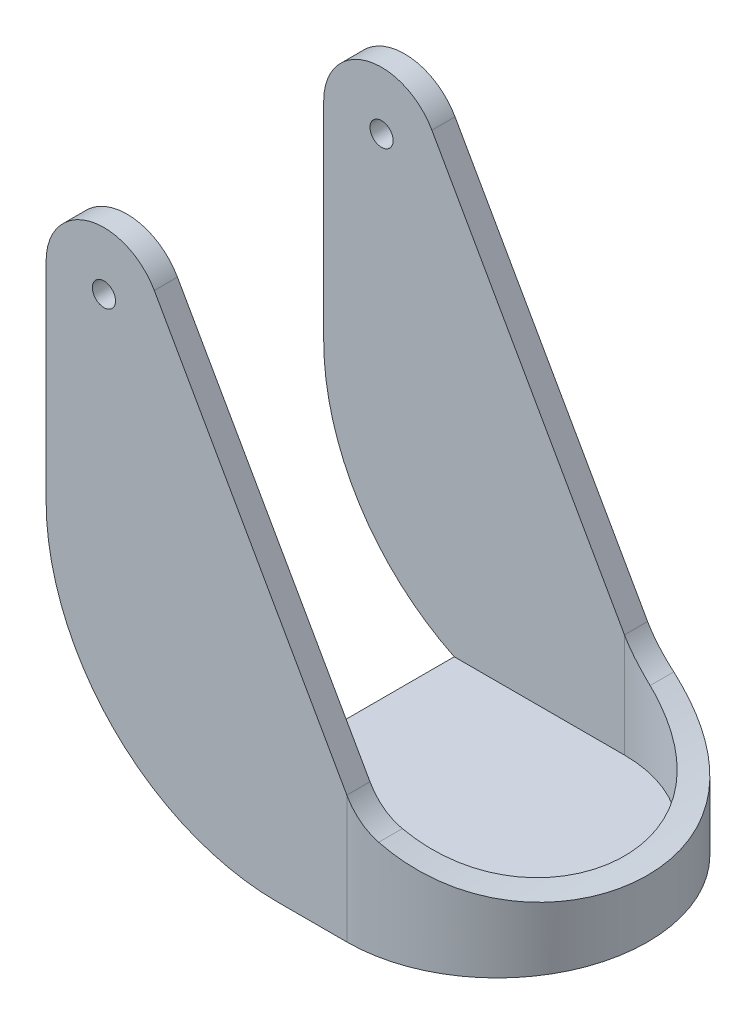
ISO-10303-21;
HEADER;
FILE_DESCRIPTION(('STEP AP214'),'2;1');
FILE_NAME('part.step','',(''),(''),'','','');
FILE_SCHEMA(('AUTOMOTIVE_DESIGN { 1 0 10303 214 1 1 1 1 }'));
ENDSEC;
DATA;
#1=APPLICATION_CONTEXT('core data for automotive mechanical design processes');
#2=APPLICATION_PROTOCOL_DEFINITION('international standard','automotive_design',2000,#1);
#3=PRODUCT_CONTEXT('',#1,'mechanical');
#4=PRODUCT('Part','Part','',(#3));
#5=PRODUCT_RELATED_PRODUCT_CATEGORY('part','',(#4));
#6=PRODUCT_DEFINITION_FORMATION('','',#4);
#7=PRODUCT_DEFINITION_CONTEXT('part definition',#1,'design');
#8=PRODUCT_DEFINITION('design','',#6,#7);
#9=PRODUCT_DEFINITION_SHAPE('','',#8);
#10=(LENGTH_UNIT() NAMED_UNIT(*) SI_UNIT(.MILLI.,.METRE.));
#11=(NAMED_UNIT(*) PLANE_ANGLE_UNIT() SI_UNIT($,.RADIAN.));
#12=(NAMED_UNIT(*) SI_UNIT($,.STERADIAN.) SOLID_ANGLE_UNIT());
#13=UNCERTAINTY_MEASURE_WITH_UNIT(LENGTH_MEASURE(1.E-05),#10,'distance_accuracy_value','');
#14=(GEOMETRIC_REPRESENTATION_CONTEXT(3) GLOBAL_UNCERTAINTY_ASSIGNED_CONTEXT((#13)) GLOBAL_UNIT_ASSIGNED_CONTEXT((#10,
#11,#12)) REPRESENTATION_CONTEXT('',''));
#15=CARTESIAN_POINT('',(0.,0.,0.));
#16=DIRECTION('',(0.,0.,1.));
#17=DIRECTION('',(1.,0.,0.));
#18=AXIS2_PLACEMENT_3D('',#15,#16,#17);
#19=CARTESIAN_POINT('',(-26.,13.,13.));
#20=DIRECTION('',(1.,0.,0.));
#21=DIRECTION('',(0.,0.,-1.));
#22=AXIS2_PLACEMENT_3D('',#19,#20,#21);
#23=PLANE('',#22);
#24=DIRECTION('',(0.,-1.,0.));
#25=VECTOR('',#24,1.);
#26=CARTESIAN_POINT('',(-26.,13.,-13.));
#27=LINE('',#26,#25);
#28=CARTESIAN_POINT('',(-26.,40.,-13.));
#29=VERTEX_POINT('',#28);
#30=CARTESIAN_POINT('',(-26.,22.,-13.));
#31=VERTEX_POINT('',#30);
#32=EDGE_CURVE('E165',#29,#31,#27,.T.);
#33=ORIENTED_EDGE('',*,*,#32,.T.);
#34=DIRECTION('',(0.,0.,1.));
#35=VECTOR('',#34,1.);
#36=CARTESIAN_POINT('',(-26.,22.,13.));
#37=LINE('',#36,#35);
#38=CARTESIAN_POINT('',(-26.,22.,-11.));
#39=VERTEX_POINT('',#38);
#40=EDGE_CURVE('E332',#31,#39,#37,.T.);
#41=ORIENTED_EDGE('',*,*,#40,.T.);
#42=DIRECTION('',(0.,-1.,0.));
#43=VECTOR('',#42,1.);
#44=CARTESIAN_POINT('',(-26.,13.,-11.));
#45=LINE('',#44,#43);
#46=CARTESIAN_POINT('',(-26.,40.,-11.));
#47=VERTEX_POINT('',#46);
#48=EDGE_CURVE('E265',#47,#39,#45,.T.);
#49=ORIENTED_EDGE('',*,*,#48,.F.);
#50=DIRECTION('',(0.,0.,-1.));
#51=VECTOR('',#50,1.);
#52=CARTESIAN_POINT('',(-26.,40.,-11.));
#53=LINE('',#52,#51);
#54=EDGE_CURVE('E273',#47,#29,#53,.T.);
#55=ORIENTED_EDGE('',*,*,#54,.T.);
#56=EDGE_LOOP('',(#33,#41,#49,#55));
#57=FACE_BOUND('',#56,.T.);
#58=ADVANCED_FACE('F41',(#57),#23,.F.);
#59=CARTESIAN_POINT('',(-26.,13.,-13.));
#60=DIRECTION('',(0.,0.,1.));
#61=DIRECTION('',(1.,0.,0.));
#62=AXIS2_PLACEMENT_3D('',#59,#60,#61);
#63=PLANE('',#62);
#64=DIRECTION('',(-1.,0.,0.));
#65=VECTOR('',#64,1.);
#66=CARTESIAN_POINT('',(0.,2.,-13.));
#67=LINE('',#66,#65);
#68=CARTESIAN_POINT('',(0.,2.,-13.));
#69=VERTEX_POINT('',#68);
#70=CARTESIAN_POINT('',(-6.,2.,-13.));
#71=VERTEX_POINT('',#70);
#72=EDGE_CURVE('E152',#69,#71,#67,.T.);
#73=ORIENTED_EDGE('',*,*,#72,.T.);
#74=CARTESIAN_POINT('',(-6.,22.,-13.));
#75=DIRECTION('',(0.,0.,1.));
#76=DIRECTION('',(1.,0.,0.));
#77=AXIS2_PLACEMENT_3D('',#74,#75,#76);
#78=CIRCLE('',#77,20.);
#79=EDGE_CURVE('E13',#71,#31,#78,.F.);
#80=ORIENTED_EDGE('',*,*,#79,.T.);
#81=ORIENTED_EDGE('',*,*,#32,.F.);
#82=CARTESIAN_POINT('',(-21.,40.,-13.));
#83=DIRECTION('',(0.,0.,1.));
#84=DIRECTION('',(-1.,0.,0.));
#85=AXIS2_PLACEMENT_3D('',#82,#83,#84);
#86=CIRCLE('',#85,5.);
#87=CARTESIAN_POINT('',(-16.6469149015077,42.4598069284569,-13.));
#88=VERTEX_POINT('',#87);
#89=EDGE_CURVE('E262',#88,#29,#86,.T.);
#90=ORIENTED_EDGE('',*,*,#89,.F.);
#91=DIRECTION('',(-0.491961385691387,0.87061701969845,0.));
#92=VECTOR('',#91,1.);
#93=CARTESIAN_POINT('',(-16.6469149015078,42.4598069284569,-13.));
#94=LINE('',#93,#92);
#95=CARTESIAN_POINT('',(0.,13.,-13.));
#96=VERTEX_POINT('',#95);
#97=EDGE_CURVE('E269',#96,#88,#94,.T.);
#98=ORIENTED_EDGE('',*,*,#97,.F.);
#99=DIRECTION('',(0.,-1.,0.));
#100=VECTOR('',#99,1.);
#101=CARTESIAN_POINT('',(0.,13.,-13.));
#102=LINE('',#101,#100);
#103=EDGE_CURVE('E163',#96,#69,#102,.T.);
#104=ORIENTED_EDGE('',*,*,#103,.T.);
#105=EDGE_LOOP('',(#73,#80,#81,#90,#98,#104));
#106=FACE_BOUND('',#105,.T.);
#107=CARTESIAN_POINT('',(-21.,40.,-13.));
#108=DIRECTION('',(0.,0.,1.));
#109=DIRECTION('',(1.,0.,0.));
#110=AXIS2_PLACEMENT_3D('',#107,#108,#109);
#111=CIRCLE('',#110,1.);
#112=CARTESIAN_POINT('',(-20.,40.,-13.));
#113=VERTEX_POINT('',#112);
#114=EDGE_CURVE('E254',#113,#113,#111,.T.);
#115=ORIENTED_EDGE('',*,*,#114,.T.);
#116=EDGE_LOOP('',(#115));
#117=FACE_BOUND('',#116,.T.);
#118=ADVANCED_FACE('F357',(#106,#117),#63,.F.);
#119=DIRECTION('',(0.,-1.,0.));
#120=VECTOR('',#119,1.);
#121=CARTESIAN_POINT('',(-26.,13.,11.));
#122=LINE('',#121,#120);
#123=CARTESIAN_POINT('',(-26.,40.,11.));
#124=VERTEX_POINT('',#123);
#125=CARTESIAN_POINT('',(-26.,22.,11.));
#126=VERTEX_POINT('',#125);
#127=EDGE_CURVE('E174',#124,#126,#122,.T.);
#128=ORIENTED_EDGE('',*,*,#127,.T.);
#129=DIRECTION('',(0.,0.,1.));
#130=VECTOR('',#129,1.);
#131=CARTESIAN_POINT('',(-26.,22.,13.));
#132=LINE('',#131,#130);
#133=CARTESIAN_POINT('',(-26.,22.,13.));
#134=VERTEX_POINT('',#133);
#135=EDGE_CURVE('E323',#126,#134,#132,.T.);
#136=ORIENTED_EDGE('',*,*,#135,.T.);
#137=DIRECTION('',(0.,-1.,0.));
#138=VECTOR('',#137,1.);
#139=CARTESIAN_POINT('',(-26.,13.,13.));
#140=LINE('',#139,#138);
#141=CARTESIAN_POINT('',(-26.,40.,13.));
#142=VERTEX_POINT('',#141);
#143=EDGE_CURVE('E162',#142,#134,#140,.T.);
#144=ORIENTED_EDGE('',*,*,#143,.F.);
#145=DIRECTION('',(0.,0.,1.));
#146=VECTOR('',#145,1.);
#147=CARTESIAN_POINT('',(-26.,40.,11.));
#148=LINE('',#147,#146);
#149=EDGE_CURVE('E167',#124,#142,#148,.T.);
#150=ORIENTED_EDGE('',*,*,#149,.F.);
#151=EDGE_LOOP('',(#128,#136,#144,#150));
#152=FACE_BOUND('',#151,.T.);
#153=ADVANCED_FACE('F359',(#152),#23,.F.);
#154=CARTESIAN_POINT('',(-26.,13.,13.));
#155=DIRECTION('',(0.,0.,-1.));
#156=DIRECTION('',(-1.,0.,0.));
#157=AXIS2_PLACEMENT_3D('',#154,#155,#156);
#158=PLANE('',#157);
#159=ORIENTED_EDGE('',*,*,#143,.T.);
#160=CARTESIAN_POINT('',(-6.,22.,13.));
#161=DIRECTION('',(0.,0.,-1.));
#162=DIRECTION('',(-1.,0.,0.));
#163=AXIS2_PLACEMENT_3D('',#160,#161,#162);
#164=CIRCLE('',#163,20.);
#165=CARTESIAN_POINT('',(-6.00000000000001,2.,13.));
#166=VERTEX_POINT('',#165);
#167=EDGE_CURVE('E63',#134,#166,#164,.F.);
#168=ORIENTED_EDGE('',*,*,#167,.T.);
#169=DIRECTION('',(1.,0.,0.));
#170=VECTOR('',#169,1.);
#171=CARTESIAN_POINT('',(-26.,2.,13.));
#172=LINE('',#171,#170);
#173=CARTESIAN_POINT('',(0.,2.,13.));
#174=VERTEX_POINT('',#173);
#175=EDGE_CURVE('E139',#166,#174,#172,.T.);
#176=ORIENTED_EDGE('',*,*,#175,.T.);
#177=DIRECTION('',(0.,-1.,0.));
#178=VECTOR('',#177,1.);
#179=CARTESIAN_POINT('',(0.,13.,13.));
#180=LINE('',#179,#178);
#181=CARTESIAN_POINT('',(0.,13.,13.));
#182=VERTEX_POINT('',#181);
#183=EDGE_CURVE('E145',#182,#174,#180,.T.);
#184=ORIENTED_EDGE('',*,*,#183,.F.);
#185=DIRECTION('',(-0.491961385691387,0.87061701969845,0.));
#186=VECTOR('',#185,1.);
#187=CARTESIAN_POINT('',(-16.6469149015078,42.4598069284569,13.));
#188=LINE('',#187,#186);
#189=CARTESIAN_POINT('',(-16.6469149015077,42.4598069284569,13.));
#190=VERTEX_POINT('',#189);
#191=EDGE_CURVE('E289',#182,#190,#188,.T.);
#192=ORIENTED_EDGE('',*,*,#191,.T.);
#193=CARTESIAN_POINT('',(-21.,40.,13.));
#194=DIRECTION('',(0.,0.,1.));
#195=DIRECTION('',(-1.,0.,0.));
#196=AXIS2_PLACEMENT_3D('',#193,#194,#195);
#197=CIRCLE('',#196,5.);
#198=EDGE_CURVE('E295',#190,#142,#197,.T.);
#199=ORIENTED_EDGE('',*,*,#198,.T.);
#200=EDGE_LOOP('',(#159,#168,#176,#184,#192,#199));
#201=FACE_BOUND('',#200,.T.);
#202=CARTESIAN_POINT('',(-21.,40.,13.));
#203=DIRECTION('',(0.,0.,1.));
#204=DIRECTION('',(1.,0.,0.));
#205=AXIS2_PLACEMENT_3D('',#202,#203,#204);
#206=CIRCLE('',#205,1.);
#207=CARTESIAN_POINT('',(-20.,40.,13.));
#208=VERTEX_POINT('',#207);
#209=EDGE_CURVE('E280',#208,#208,#206,.T.);
#210=ORIENTED_EDGE('',*,*,#209,.F.);
#211=EDGE_LOOP('',(#210));
#212=FACE_BOUND('',#211,.T.);
#213=ADVANCED_FACE('F141',(#201,#212),#158,.F.);
#214=CARTESIAN_POINT('',(0.,13.,0.));
#215=DIRECTION('',(0.,-1.,0.));
#216=DIRECTION('',(0.,0.,-1.));
#217=AXIS2_PLACEMENT_3D('',#214,#215,#216);
#218=CYLINDRICAL_SURFACE('',#217,13.);
#219=ORIENTED_EDGE('',*,*,#183,.T.);
#220=CARTESIAN_POINT('',(0.,2.,0.));
#221=DIRECTION('',(0.,1.,0.));
#222=DIRECTION('',(0.,0.,1.));
#223=AXIS2_PLACEMENT_3D('',#220,#221,#222);
#224=CIRCLE('',#223,13.);
#225=EDGE_CURVE('E146',#174,#69,#224,.T.);
#226=ORIENTED_EDGE('',*,*,#225,.T.);
#227=ORIENTED_EDGE('',*,*,#103,.F.);
#228=CARTESIAN_POINT('',(0.,13.,-13.));
#229=CARTESIAN_POINT('',(0.0811098745886927,12.8564208709931,-12.9999939418672));
#230=CARTESIAN_POINT('',(0.16817712729965,12.7161966098071,-12.9992411044523));
#231=CARTESIAN_POINT('',(0.353560432381058,12.4433693045474,-12.9955235608234));
#232=CARTESIAN_POINT('',(0.451879506114819,12.310768321921,-12.9925582593283));
#233=CARTESIAN_POINT('',(0.656443601674111,12.0574129699773,-12.983808451302));
#234=CARTESIAN_POINT('',(0.762426196293615,11.9364441700734,-12.978096930991));
#235=CARTESIAN_POINT('',(0.983622464164972,11.7035332281863,-12.9632082421014));
#236=CARTESIAN_POINT('',(1.09883378784987,11.5915888031334,-12.9540319534321));
#237=CARTESIAN_POINT('',(1.31493346265966,11.3978241402921,-12.9336919006638));
#238=CARTESIAN_POINT('',(1.41438569893112,11.3143208058399,-12.9232367143954));
#239=CARTESIAN_POINT('',(1.61826498252739,11.1540989858787,-12.8992927868903));
#240=CARTESIAN_POINT('',(1.72269175183268,11.0773801218785,-12.8858042150287));
#241=CARTESIAN_POINT('',(1.93818351497277,10.929539338955,-12.8551747219404));
#242=CARTESIAN_POINT('',(2.04934152185301,10.85856747827,-12.8379635093208));
#243=CARTESIAN_POINT('',(2.27562857780598,10.7243199328689,-12.7997944595318));
#244=CARTESIAN_POINT('',(2.39075858853556,10.6610461289434,-12.7788357098401));
#245=CARTESIAN_POINT('',(2.50753237754954,10.601775609478,-12.7558724270644));
#246=B_SPLINE_CURVE_WITH_KNOTS('',3,(#228,#229,#230,#231,#232,#233,#234,#235,#236,#237,#238,
#239,#240,#241,#242,#243,#244,#245),.UNSPECIFIED.,.F.,.F.,(4,2,2,2,2,2,2,2,4),(0.,
0.49459053828577,0.989314198095594,1.47156096154483,1.95368533635482,2.34423307721305,
2.73475901646833,3.13342788848221,3.53219396857059),.UNSPECIFIED.);
#247=CARTESIAN_POINT('',(2.50753237754954,10.601775609478,-12.7558724270644));
#248=VERTEX_POINT('',#247);
#249=EDGE_CURVE('E222',#96,#248,#246,.T.);
#250=ORIENTED_EDGE('',*,*,#249,.T.);
#251=CARTESIAN_POINT('',(2.50753237754953,10.601775609478,-12.7558724270644));
#252=CARTESIAN_POINT('',(2.67357989237057,10.5174722997083,-12.7232309247006));
#253=CARTESIAN_POINT('',(2.83967471423074,10.4346072048725,-12.6872121136112));
#254=CARTESIAN_POINT('',(3.17168859235779,10.2718170739135,-12.6083114270852));
#255=CARTESIAN_POINT('',(3.33760763591024,10.1918922380132,-12.5654290853223));
#256=CARTESIAN_POINT('',(3.83473437252045,9.95660602571069,-12.4263110338985));
#257=CARTESIAN_POINT('',(4.16523846132185,9.80577004941899,-12.3196185472035));
#258=CARTESIAN_POINT('',(4.82181993085827,9.5166055897683,-12.0777743817212));
#259=CARTESIAN_POINT('',(5.1478909820654,9.37829366072567,-11.9425857996477));
#260=CARTESIAN_POINT('',(5.79214557045279,9.11473593212956,-11.6437577120768));
#261=CARTESIAN_POINT('',(6.11033040592112,8.98948797084776,-11.4801229256339));
#262=CARTESIAN_POINT('',(6.73672002925522,8.75177380438963,-11.1241531390974));
#263=CARTESIAN_POINT('',(7.04488980465667,8.63934957769805,-10.9317283927471));
#264=CARTESIAN_POINT('',(7.64701851089102,8.42761201011177,-10.5193282256813));
#265=CARTESIAN_POINT('',(7.94097651727815,8.3282995213828,-10.299351016069));
#266=CARTESIAN_POINT('',(8.51118603942403,8.14255583070751,-9.83336731553107));
#267=CARTESIAN_POINT('',(8.78745943943964,8.05610852565698,-9.58739403461675));
#268=CARTESIAN_POINT('',(9.31975857278978,7.89539054260055,-9.0708120918948));
#269=CARTESIAN_POINT('',(9.57578547674543,7.82111916033477,-8.80020485633335));
#270=CARTESIAN_POINT('',(10.0522770557004,7.68757003340984,-8.25088102759384));
#271=CARTESIAN_POINT('',(10.273895058848,7.62771636575221,-7.97330340154314));
#272=CARTESIAN_POINT('',(10.6944464145798,7.51760888399712,-7.39968120959303));
#273=CARTESIAN_POINT('',(10.8933804377008,7.46735478610744,-7.10363718995922));
#274=CARTESIAN_POINT('',(11.266841061917,7.37568547519035,-6.49506065711169));
#275=CARTESIAN_POINT('',(11.4413571533449,7.33427406411417,-6.18252112331822));
#276=CARTESIAN_POINT('',(11.764341138228,7.25958083284556,-5.54332924245456));
#277=CARTESIAN_POINT('',(11.9128089675093,7.22629903268157,-5.21667686061773));
#278=CARTESIAN_POINT('',(12.1808397966009,7.16752436951811,-4.5555340842219));
#279=CARTESIAN_POINT('',(12.3007209946572,7.14194483941453,-4.22118031417595));
#280=CARTESIAN_POINT('',(12.5128154564488,7.09747331744763,-3.54338076740806));
#281=CARTESIAN_POINT('',(12.6050290244956,7.0785812520296,-3.19993509073168));
#282=CARTESIAN_POINT('',(12.7610413087791,7.04701579749399,-2.50641889838904));
#283=CARTESIAN_POINT('',(12.824843834045,7.03434157473564,-2.15634927735032));
#284=CARTESIAN_POINT('',(12.9235510907368,7.01487071539654,-1.4519964374477));
#285=CARTESIAN_POINT('',(12.9584556055172,7.00807412287978,-1.09771318701482));
#286=CARTESIAN_POINT('',(12.9992231512338,7.00014508023099,-0.385161934752053));
#287=CARTESIAN_POINT('',(13.0049007464633,6.99904879634174,-0.0268829086747976));
#288=CARTESIAN_POINT('',(12.9866698320836,7.00258639311315,0.688894132465764));
#289=CARTESIAN_POINT('',(12.962761211018,7.00722029536039,1.04639214458178));
#290=CARTESIAN_POINT('',(12.8855433305379,7.02235011602428,1.75809574579851));
#291=CARTESIAN_POINT('',(12.8322323365857,7.0328463802804,2.11230113940372));
#292=CARTESIAN_POINT('',(12.6966310918198,7.05998929410228,2.81488183404293));
#293=CARTESIAN_POINT('',(12.6143408586279,7.07663593992812,3.16325713862196));
#294=CARTESIAN_POINT('',(12.421288686113,7.11654313655217,3.8522438140729));
#295=CARTESIAN_POINT('',(12.3104814867209,7.13981420744697,4.19284189724551));
#296=CARTESIAN_POINT('',(12.0613712028866,7.19351680525583,4.86324978051866));
#297=CARTESIAN_POINT('',(11.9230680834531,7.22394834128231,5.19305956688941));
#298=CARTESIAN_POINT('',(11.6201431996891,7.29262289301151,5.83949238078567));
#299=CARTESIAN_POINT('',(11.4555231288622,7.33086540611948,6.15611625517706));
#300=CARTESIAN_POINT('',(11.1013869056699,7.41587743629413,6.77391892242735));
#301=CARTESIAN_POINT('',(10.9118709482686,7.46264688658597,7.07509783621276));
#302=CARTESIAN_POINT('',(10.5107370534454,7.56516655177487,7.65826125788489));
#303=CARTESIAN_POINT('',(10.2992459898781,7.62086612254129,7.94034194850334));
#304=CARTESIAN_POINT('',(9.8552272799391,7.74212833853623,8.48516282962268));
#305=CARTESIAN_POINT('',(9.62269967657087,7.80769096360263,8.74790305965782));
#306=CARTESIAN_POINT('',(9.13878265996559,7.94930733088135,9.25228528761113));
#307=CARTESIAN_POINT('',(8.88739521236258,8.02535998048022,9.49392947856262));
#308=CARTESIAN_POINT('',(8.36809478477809,8.1884873603282,9.95467111270657));
#309=CARTESIAN_POINT('',(8.10018213979217,8.27556186718201,10.1737690127129));
#310=CARTESIAN_POINT('',(7.55063244720755,8.46101801043554,10.588022887138));
#311=CARTESIAN_POINT('',(7.26901044257387,8.55938740742221,10.7832043124905));
#312=CARTESIAN_POINT('',(6.69435386448393,8.76772951910135,11.1490654567298));
#313=CARTESIAN_POINT('',(6.40131843650019,8.87770310366153,11.3197433365262));
#314=CARTESIAN_POINT('',(5.80654116816105,9.10925532505222,11.6360438177985));
#315=CARTESIAN_POINT('',(5.50480098561618,9.23083176218085,11.7816711538151));
#316=CARTESIAN_POINT('',(4.8952248905677,9.48541691669351,12.0477111667087));
#317=CARTESIAN_POINT('',(4.58739077578059,9.61842230009337,12.1681311619374));
#318=CARTESIAN_POINT('',(3.98434499133455,9.88826900253964,12.3782666779978));
#319=CARTESIAN_POINT('',(3.68932248469592,10.0245392946381,12.4692653571835));
#320=CARTESIAN_POINT('',(3.09862557714084,10.3062959982207,12.629016672693));
#321=CARTESIAN_POINT('',(2.80295473475085,10.4517581246053,12.6978252202721));
#322=CARTESIAN_POINT('',(2.50753237754953,10.601775609478,12.7558724270644));
#323=B_SPLINE_CURVE_WITH_KNOTS('',3,(#251,#252,#253,#254,#255,#256,#257,#258,#259,#260,#261,
#262,#263,#264,#265,#266,#267,#268,#269,#270,#271,#272,#273,#274,#275,#276,#277,#278,#279,#280,
#281,#282,#283,#284,#285,#286,#287,#288,#289,#290,#291,#292,#293,#294,#295,#296,#297,#298,#299,
#300,#301,#302,#303,#304,#305,#306,#307,#308,#309,#310,#311,#312,#313,#314,#315,#316,#317,#318,
#319,#320,#321,#322),.UNSPECIFIED.,.F.,.F.,(4,2,2,2,2,2,2,2,2,2,2,2,2,2,2,2,2,2,2,2,2,2,2,2,2,2,
2,2,2,2,2,2,2,2,2,4),(0.,0.567112976310076,1.13426450012161,2.26881674171251,3.40484738951128,
4.54068975617926,5.68014961751813,6.81968349887932,7.95777882928399,9.09580830858987,
10.1751149528512,11.254389684615,12.3341275249764,13.4138680253961,14.4809613160366,
15.548042869467,16.6149813176453,17.6819277644845,18.7556353837638,19.8293470478968,
20.9031220604064,21.976896419977,23.0523856211102,24.127876190918,25.203297580429,
26.278710548629,27.3482274177885,28.4177421006644,29.4871454696976,30.5565271671155,
31.6247608028388,32.6930745719586,33.7611862079207,34.8289873116738,35.8405464853042,
36.8495366054198),.UNSPECIFIED.);
#324=CARTESIAN_POINT('',(2.50753237754954,10.601775609478,12.7558724270644));
#325=VERTEX_POINT('',#324);
#326=EDGE_CURVE('E240',#248,#325,#323,.T.);
#327=ORIENTED_EDGE('',*,*,#326,.T.);
#328=CARTESIAN_POINT('',(2.50753237754954,10.601775609478,12.7558724270644));
#329=CARTESIAN_POINT('',(2.36275255318751,10.6752458422251,12.784350817623));
#330=CARTESIAN_POINT('',(2.22051363780897,10.7548835675639,12.8097343064124));
#331=CARTESIAN_POINT('',(1.94236483698037,10.9258972686388,12.8548413357145));
#332=CARTESIAN_POINT('',(1.80645390428157,11.017271292602,12.8745658155732));
#333=CARTESIAN_POINT('',(1.5454597928653,11.208764113998,12.9084651118122));
#334=CARTESIAN_POINT('',(1.42019096431867,11.3086075121459,12.9227662292402));
#335=CARTESIAN_POINT('',(1.17785005366185,11.5181732497238,12.947103945901));
#336=CARTESIAN_POINT('',(1.06077680152191,11.6278941738691,12.9571411549057));
#337=CARTESIAN_POINT('',(0.765604247706876,11.9277196823736,12.9787267686029));
#338=CARTESIAN_POINT('',(0.594819527697823,12.125387546177,12.9873346235273));
#339=CARTESIAN_POINT('',(0.357442538882254,12.439320966113,12.9953339978572));
#340=CARTESIAN_POINT('',(0.280758612036687,12.5480896788757,12.9971742423066));
#341=CARTESIAN_POINT('',(0.134773495035032,12.7704988419723,12.9995050276732));
#342=CARTESIAN_POINT('',(0.0654728060335353,12.8841396222759,12.9999954770259));
#343=CARTESIAN_POINT('',(0.,13.,13.));
#344=B_SPLINE_CURVE_WITH_KNOTS('',3,(#328,#329,#330,#331,#332,#333,#334,#335,#336,#337,#338,
#339,#340,#341,#342,#343),.UNSPECIFIED.,.F.,.F.,(4,2,2,2,2,2,2,4),(0.,0.494312878453947,
0.988543657744197,1.47043087615315,1.95224915772629,2.73363888097451,3.13267758361167,
3.53174335470355),.UNSPECIFIED.);
#345=EDGE_CURVE('E160',#325,#182,#344,.T.);
#346=ORIENTED_EDGE('',*,*,#345,.T.);
#347=EDGE_LOOP('',(#219,#226,#227,#250,#327,#346));
#348=FACE_BOUND('',#347,.T.);
#349=ADVANCED_FACE('F158',(#348),#218,.T.);
#350=CARTESIAN_POINT('',(-21.,40.,11.));
#351=DIRECTION('',(0.,0.,1.));
#352=DIRECTION('',(1.,0.,0.));
#353=AXIS2_PLACEMENT_3D('',#350,#351,#352);
#354=CYLINDRICAL_SURFACE('',#353,5.);
#355=ORIENTED_EDGE('',*,*,#198,.F.);
#356=DIRECTION('',(0.,0.,1.));
#357=VECTOR('',#356,1.);
#358=CARTESIAN_POINT('',(-16.6469149015077,42.4598069284569,11.));
#359=LINE('',#358,#357);
#360=CARTESIAN_POINT('',(-16.6469149015077,42.4598069284569,11.));
#361=VERTEX_POINT('',#360);
#362=EDGE_CURVE('E303',#361,#190,#359,.T.);
#363=ORIENTED_EDGE('',*,*,#362,.F.);
#364=CARTESIAN_POINT('',(-21.,40.,11.));
#365=DIRECTION('',(0.,0.,1.));
#366=DIRECTION('',(-1.,0.,0.));
#367=AXIS2_PLACEMENT_3D('',#364,#365,#366);
#368=CIRCLE('',#367,5.);
#369=EDGE_CURVE('E178',#361,#124,#368,.T.);
#370=ORIENTED_EDGE('',*,*,#369,.T.);
#371=ORIENTED_EDGE('',*,*,#149,.T.);
#372=EDGE_LOOP('',(#355,#363,#370,#371));
#373=FACE_BOUND('',#372,.T.);
#374=ADVANCED_FACE('F234',(#373),#354,.T.);
#375=CARTESIAN_POINT('',(-16.6469149015078,42.4598069284569,11.));
#376=DIRECTION('',(0.87061701969845,0.491961385691387,0.));
#377=DIRECTION('',(-0.491961385691387,0.87061701969845,0.));
#378=AXIS2_PLACEMENT_3D('',#375,#376,#377);
#379=PLANE('',#378);
#380=ORIENTED_EDGE('',*,*,#191,.F.);
#381=DIRECTION('',(0.,0.,1.));
#382=VECTOR('',#381,1.);
#383=CARTESIAN_POINT('',(0.,13.,11.));
#384=LINE('',#383,#382);
#385=CARTESIAN_POINT('',(0.,13.,11.));
#386=VERTEX_POINT('',#385);
#387=EDGE_CURVE('E177',#386,#182,#384,.T.);
#388=ORIENTED_EDGE('',*,*,#387,.F.);
#389=DIRECTION('',(-0.491961385691387,0.87061701969845,0.));
#390=VECTOR('',#389,1.);
#391=CARTESIAN_POINT('',(-16.6469149015078,42.4598069284569,11.));
#392=LINE('',#391,#390);
#393=EDGE_CURVE('E292',#386,#361,#392,.T.);
#394=ORIENTED_EDGE('',*,*,#393,.T.);
#395=ORIENTED_EDGE('',*,*,#362,.T.);
#396=EDGE_LOOP('',(#380,#388,#394,#395));
#397=FACE_BOUND('',#396,.T.);
#398=ADVANCED_FACE('F235',(#397),#379,.T.);
#399=CARTESIAN_POINT('',(-21.,40.,11.));
#400=DIRECTION('',(0.,0.,-1.));
#401=DIRECTION('',(-1.,0.,0.));
#402=AXIS2_PLACEMENT_3D('',#399,#400,#401);
#403=PLANE('',#402);
#404=CARTESIAN_POINT('',(-21.,40.,11.));
#405=DIRECTION('',(0.,0.,1.));
#406=DIRECTION('',(1.,0.,0.));
#407=AXIS2_PLACEMENT_3D('',#404,#405,#406);
#408=CIRCLE('',#407,1.);
#409=CARTESIAN_POINT('',(-20.,40.,11.));
#410=VERTEX_POINT('',#409);
#411=EDGE_CURVE('E286',#410,#410,#408,.T.);
#412=ORIENTED_EDGE('',*,*,#411,.T.);
#413=EDGE_LOOP('',(#412));
#414=FACE_BOUND('',#413,.T.);
#415=DIRECTION('',(-1.,0.,0.));
#416=VECTOR('',#415,1.);
#417=CARTESIAN_POINT('',(-26.,4.,11.));
#418=LINE('',#417,#416);
#419=CARTESIAN_POINT('',(0.,4.,11.));
#420=VERTEX_POINT('',#419);
#421=CARTESIAN_POINT('',(-14.7177978870814,4.,11.));
#422=VERTEX_POINT('',#421);
#423=EDGE_CURVE('E246',#420,#422,#418,.T.);
#424=ORIENTED_EDGE('',*,*,#423,.T.);
#425=CARTESIAN_POINT('',(-6.,22.,11.));
#426=DIRECTION('',(0.,0.,-1.));
#427=DIRECTION('',(-1.,0.,0.));
#428=AXIS2_PLACEMENT_3D('',#425,#426,#427);
#429=CIRCLE('',#428,20.);
#430=EDGE_CURVE('E324',#422,#126,#429,.T.);
#431=ORIENTED_EDGE('',*,*,#430,.T.);
#432=ORIENTED_EDGE('',*,*,#127,.F.);
#433=ORIENTED_EDGE('',*,*,#369,.F.);
#434=ORIENTED_EDGE('',*,*,#393,.F.);
#435=DIRECTION('',(0.,1.,0.));
#436=VECTOR('',#435,1.);
#437=CARTESIAN_POINT('',(0.,-42.0464865000618,11.));
#438=LINE('',#437,#436);
#439=EDGE_CURVE('E245',#420,#386,#438,.T.);
#440=ORIENTED_EDGE('',*,*,#439,.F.);
#441=EDGE_LOOP('',(#424,#431,#432,#433,#434,#440));
#442=FACE_BOUND('',#441,.T.);
#443=ADVANCED_FACE('F314',(#414,#442),#403,.T.);
#444=CARTESIAN_POINT('',(-21.,40.,11.));
#445=DIRECTION('',(0.,0.,1.));
#446=DIRECTION('',(1.,0.,0.));
#447=AXIS2_PLACEMENT_3D('',#444,#445,#446);
#448=CYLINDRICAL_SURFACE('',#447,1.);
#449=ORIENTED_EDGE('',*,*,#411,.F.);
#450=EDGE_LOOP('',(#449));
#451=FACE_BOUND('',#450,.T.);
#452=ORIENTED_EDGE('',*,*,#209,.T.);
#453=EDGE_LOOP('',(#452));
#454=FACE_BOUND('',#453,.T.);
#455=ADVANCED_FACE('F394',(#451,#454),#448,.F.);
#456=CARTESIAN_POINT('',(-21.,40.,-11.));
#457=DIRECTION('',(0.,0.,1.));
#458=DIRECTION('',(-1.,0.,0.));
#459=AXIS2_PLACEMENT_3D('',#456,#457,#458);
#460=PLANE('',#459);
#461=ORIENTED_EDGE('',*,*,#48,.T.);
#462=CARTESIAN_POINT('',(-6.,22.,-11.));
#463=DIRECTION('',(0.,0.,1.));
#464=DIRECTION('',(1.,0.,0.));
#465=AXIS2_PLACEMENT_3D('',#462,#463,#464);
#466=CIRCLE('',#465,20.);
#467=CARTESIAN_POINT('',(-14.7177978870814,4.,-11.));
#468=VERTEX_POINT('',#467);
#469=EDGE_CURVE('E330',#39,#468,#466,.T.);
#470=ORIENTED_EDGE('',*,*,#469,.T.);
#471=DIRECTION('',(1.,0.,0.));
#472=VECTOR('',#471,1.);
#473=CARTESIAN_POINT('',(-26.,4.,-11.));
#474=LINE('',#473,#472);
#475=CARTESIAN_POINT('',(0.,4.,-11.));
#476=VERTEX_POINT('',#475);
#477=EDGE_CURVE('E252',#468,#476,#474,.T.);
#478=ORIENTED_EDGE('',*,*,#477,.T.);
#479=DIRECTION('',(0.,1.,0.));
#480=VECTOR('',#479,1.);
#481=CARTESIAN_POINT('',(0.,-42.0464865000618,-11.));
#482=LINE('',#481,#480);
#483=CARTESIAN_POINT('',(0.,13.,-11.));
#484=VERTEX_POINT('',#483);
#485=EDGE_CURVE('E250',#476,#484,#482,.T.);
#486=ORIENTED_EDGE('',*,*,#485,.T.);
#487=DIRECTION('',(-0.491961385691387,0.87061701969845,0.));
#488=VECTOR('',#487,1.);
#489=CARTESIAN_POINT('',(-16.6469149015078,42.4598069284569,-11.));
#490=LINE('',#489,#488);
#491=CARTESIAN_POINT('',(-16.6469149015077,42.4598069284569,-11.));
#492=VERTEX_POINT('',#491);
#493=EDGE_CURVE('E271',#484,#492,#490,.T.);
#494=ORIENTED_EDGE('',*,*,#493,.T.);
#495=CARTESIAN_POINT('',(-21.,40.,-11.));
#496=DIRECTION('',(0.,0.,1.));
#497=DIRECTION('',(-1.,0.,0.));
#498=AXIS2_PLACEMENT_3D('',#495,#496,#497);
#499=CIRCLE('',#498,5.);
#500=EDGE_CURVE('E268',#492,#47,#499,.T.);
#501=ORIENTED_EDGE('',*,*,#500,.T.);
#502=EDGE_LOOP('',(#461,#470,#478,#486,#494,#501));
#503=FACE_BOUND('',#502,.T.);
#504=CARTESIAN_POINT('',(-21.,40.,-11.));
#505=DIRECTION('',(0.,0.,1.));
#506=DIRECTION('',(1.,0.,0.));
#507=AXIS2_PLACEMENT_3D('',#504,#505,#506);
#508=CIRCLE('',#507,1.);
#509=CARTESIAN_POINT('',(-20.,40.,-11.));
#510=VERTEX_POINT('',#509);
#511=EDGE_CURVE('E259',#510,#510,#508,.T.);
#512=ORIENTED_EDGE('',*,*,#511,.F.);
#513=EDGE_LOOP('',(#512));
#514=FACE_BOUND('',#513,.T.);
#515=ADVANCED_FACE('F402',(#503,#514),#460,.T.);
#516=CARTESIAN_POINT('',(-16.6469149015078,42.4598069284569,-11.));
#517=DIRECTION('',(-0.87061701969845,-0.491961385691387,0.));
#518=DIRECTION('',(0.491961385691387,-0.87061701969845,0.));
#519=AXIS2_PLACEMENT_3D('',#516,#517,#518);
#520=PLANE('',#519);
#521=ORIENTED_EDGE('',*,*,#97,.T.);
#522=DIRECTION('',(0.,0.,-1.));
#523=VECTOR('',#522,1.);
#524=CARTESIAN_POINT('',(-16.6469149015077,42.4598069284569,-11.));
#525=LINE('',#524,#523);
#526=EDGE_CURVE('E281',#492,#88,#525,.T.);
#527=ORIENTED_EDGE('',*,*,#526,.F.);
#528=ORIENTED_EDGE('',*,*,#493,.F.);
#529=DIRECTION('',(0.,0.,-1.));
#530=VECTOR('',#529,1.);
#531=CARTESIAN_POINT('',(0.,13.,-11.));
#532=LINE('',#531,#530);
#533=EDGE_CURVE('E277',#484,#96,#532,.T.);
#534=ORIENTED_EDGE('',*,*,#533,.T.);
#535=EDGE_LOOP('',(#521,#527,#528,#534));
#536=FACE_BOUND('',#535,.T.);
#537=ADVANCED_FACE('F410',(#536),#520,.F.);
#538=CARTESIAN_POINT('',(-21.,40.,-11.));
#539=DIRECTION('',(0.,0.,-1.));
#540=DIRECTION('',(-1.,0.,0.));
#541=AXIS2_PLACEMENT_3D('',#538,#539,#540);
#542=CYLINDRICAL_SURFACE('',#541,5.);
#543=ORIENTED_EDGE('',*,*,#89,.T.);
#544=ORIENTED_EDGE('',*,*,#54,.F.);
#545=ORIENTED_EDGE('',*,*,#500,.F.);
#546=ORIENTED_EDGE('',*,*,#526,.T.);
#547=EDGE_LOOP('',(#543,#544,#545,#546));
#548=FACE_BOUND('',#547,.T.);
#549=ADVANCED_FACE('F418',(#548),#542,.T.);
#550=CARTESIAN_POINT('',(-21.,40.,-11.));
#551=DIRECTION('',(0.,0.,-1.));
#552=DIRECTION('',(-1.,0.,0.));
#553=AXIS2_PLACEMENT_3D('',#550,#551,#552);
#554=CYLINDRICAL_SURFACE('',#553,1.);
#555=ORIENTED_EDGE('',*,*,#511,.T.);
#556=EDGE_LOOP('',(#555));
#557=FACE_BOUND('',#556,.T.);
#558=ORIENTED_EDGE('',*,*,#114,.F.);
#559=EDGE_LOOP('',(#558));
#560=FACE_BOUND('',#559,.T.);
#561=ADVANCED_FACE('F426',(#557,#560),#554,.F.);
#562=CARTESIAN_POINT('',(0.,-42.0464865000618,0.));
#563=DIRECTION('',(0.,1.,0.));
#564=DIRECTION('',(0.,0.,1.));
#565=AXIS2_PLACEMENT_3D('',#562,#563,#564);
#566=CYLINDRICAL_SURFACE('',#565,11.);
#567=ORIENTED_EDGE('',*,*,#439,.T.);
#568=CARTESIAN_POINT('',(0.,13.,11.));
#569=CARTESIAN_POINT('',(0.0800425791992085,12.8583098375522,10.9999930083435));
#570=CARTESIAN_POINT('',(0.165889177012792,12.7198843971971,10.9991265060107));
#571=CARTESIAN_POINT('',(0.34854389476916,12.4504446889331,10.9948580966578));
#572=CARTESIAN_POINT('',(0.445355450279253,12.3194327632335,10.9914553931148));
#573=CARTESIAN_POINT('',(0.646626385378617,12.0690464305921,10.9814275150088));
#574=CARTESIAN_POINT('',(0.750825756881509,11.9494596597548,10.9748872750994));
#575=CARTESIAN_POINT('',(0.968191056922109,11.7190752679952,10.9578503835052));
#576=CARTESIAN_POINT('',(1.08135473099242,11.6082754511466,10.9473547241051));
#577=CARTESIAN_POINT('',(1.29666960748384,11.4134950852455,10.9237533804659));
#578=CARTESIAN_POINT('',(1.3976103719812,11.3280864137509,10.9113517155934));
#579=CARTESIAN_POINT('',(1.60457791000445,11.1643525425137,10.8828416743997));
#580=CARTESIAN_POINT('',(1.71060420520681,11.0860266785839,10.8667336461444));
#581=CARTESIAN_POINT('',(1.92948050153971,10.9351818586936,10.8300354285841));
#582=CARTESIAN_POINT('',(2.04242916559839,10.8628279585237,10.8093546753109));
#583=CARTESIAN_POINT('',(2.27224191427784,10.7261760063607,10.7633969692598));
#584=CARTESIAN_POINT('',(2.38910710836967,10.6618802619444,10.7381187049705));
#585=CARTESIAN_POINT('',(2.50753237754954,10.601775609478,10.7103819434949));
#586=B_SPLINE_CURVE_WITH_KNOTS('',3,(#568,#569,#570,#571,#572,#573,#574,#575,#576,#577,#578,
#579,#580,#581,#582,#583,#584,#585),.UNSPECIFIED.,.F.,.F.,(4,2,2,2,2,2,2,2,4),(0.,
0.488091089411642,0.976335533999551,1.45205082328802,1.92764685061778,2.3257423209652,
2.72380042127854,3.13058972047473,3.5374952451616),.UNSPECIFIED.);
#587=CARTESIAN_POINT('',(2.50753237754954,10.601775609478,10.7103819434949));
#588=VERTEX_POINT('',#587);
#589=EDGE_CURVE('E211',#386,#588,#586,.T.);
#590=ORIENTED_EDGE('',*,*,#589,.T.);
#591=CARTESIAN_POINT('',(2.50753237754953,10.601775609478,10.7103819434949));
#592=CARTESIAN_POINT('',(2.79136842510282,10.4576339645989,10.6439666559666));
#593=CARTESIAN_POINT('',(3.0748052955884,10.3180343274429,10.5656699658391));
#594=CARTESIAN_POINT('',(3.63867285757203,10.0483707516919,10.3849675179818));
#595=CARTESIAN_POINT('',(3.91910211880476,9.91831119191567,10.2825507790357));
#596=CARTESIAN_POINT('',(4.47497639946474,9.66808998749161,10.0531185299287));
#597=CARTESIAN_POINT('',(4.75041168675001,9.54794632415851,9.9260596732008));
#598=CARTESIAN_POINT('',(5.29317623869759,9.31817885506602,9.64755372847992));
#599=CARTESIAN_POINT('',(5.56050681854541,9.20855333616442,9.49611062286818));
#600=CARTESIAN_POINT('',(6.08531210619325,8.99965866751636,9.16869322102646));
#601=CARTESIAN_POINT('',(6.3427523469896,8.90042396303393,8.9926415873927));
#602=CARTESIAN_POINT('',(6.84419255878518,8.71273573001105,8.61714217197608));
#603=CARTESIAN_POINT('',(7.08819166929978,8.62428289127379,8.41769289485696));
#604=CARTESIAN_POINT('',(7.55978220451739,8.45814249206203,7.99683912944517));
#605=CARTESIAN_POINT('',(7.78739555489377,8.38044041261546,7.77546495849093));
#606=CARTESIAN_POINT('',(8.224088136837,8.23538085183852,7.31202621768577));
#607=CARTESIAN_POINT('',(8.43316858481814,8.16802269136811,7.06996300781949));
#608=CARTESIAN_POINT('',(8.81915913534612,8.04681717100056,6.58131977844415));
#609=CARTESIAN_POINT('',(8.99722481223617,7.99241772402682,6.33578819722001));
#610=CARTESIAN_POINT('',(9.33314265711168,7.89206011639403,5.82963939243735));
#611=CARTESIAN_POINT('',(9.49099548095201,7.84610168182492,5.5690226587517));
#612=CARTESIAN_POINT('',(9.78504191366898,7.76218314811799,5.03448536403634));
#613=CARTESIAN_POINT('',(9.92122728767218,7.724226088189,4.76055979627121));
#614=CARTESIAN_POINT('',(10.1705911996101,7.65590675111088,4.20151752286277));
#615=CARTESIAN_POINT('',(10.2837698948947,7.62554442201871,3.91640089377451));
#616=CARTESIAN_POINT('',(10.4836634602489,7.57266058489246,3.34402368849664));
#617=CARTESIAN_POINT('',(10.5709453953517,7.54996925865949,3.05697663657452));
#618=CARTESIAN_POINT('',(10.7218436216992,7.51113636083252,2.47629869323299));
#619=CARTESIAN_POINT('',(10.785460365698,7.49499466393274,2.18266792788485));
#620=CARTESIAN_POINT('',(10.888479821997,7.46902252718957,1.59096649297076));
#621=CARTESIAN_POINT('',(10.9278866632495,7.45919101114419,1.29289658937775));
#622=CARTESIAN_POINT('',(10.9821723248765,7.44568062693178,0.694391798562302));
#623=CARTESIAN_POINT('',(10.9970510472327,7.44200178335182,0.393956901893789));
#624=CARTESIAN_POINT('',(11.0021516694028,7.44073859191386,-0.206660196324273));
#625=CARTESIAN_POINT('',(10.9924124461217,7.4431446347457,-0.506842048363479));
#626=CARTESIAN_POINT('',(10.9484402629309,7.45406971718885,-1.10529392594635));
#627=CARTESIAN_POINT('',(10.9142073652203,7.46258874127693,-1.40356395634292));
#628=CARTESIAN_POINT('',(10.8215326211954,7.48587439839778,-1.99608414942197));
#629=CARTESIAN_POINT('',(10.7630898241144,7.50064127679562,-2.29033415376186));
#630=CARTESIAN_POINT('',(10.622489107715,7.53664467750331,-2.87270891699536));
#631=CARTESIAN_POINT('',(10.5403311928709,7.55788119859255,-3.16083367704459));
#632=CARTESIAN_POINT('',(10.3529961062432,7.60712281600745,-3.72893223861197));
#633=CARTESIAN_POINT('',(10.2478170216604,7.63512847479218,-4.00890536062958));
#634=CARTESIAN_POINT('',(10.0153595117426,7.69826132490163,-4.55868921288694));
#635=CARTESIAN_POINT('',(9.88808111915677,7.73338850567289,-4.82849995818572));
#636=CARTESIAN_POINT('',(9.61257093906879,7.81114787660138,-5.35602601535982));
#637=CARTESIAN_POINT('',(9.46434191920307,7.85377907563905,-5.61374291888516));
#638=CARTESIAN_POINT('',(9.14825387315853,7.94694684698267,-6.11533538549015));
#639=CARTESIAN_POINT('',(8.98039489604844,7.99748339952782,-6.35921098316644));
#640=CARTESIAN_POINT('',(8.62649755892333,8.10686609712322,-6.83159407558023));
#641=CARTESIAN_POINT('',(8.44045071424029,8.16571612617485,-7.06009431296351));
#642=CARTESIAN_POINT('',(8.05196015836891,8.29204010218317,-7.50013863878097));
#643=CARTESIAN_POINT('',(7.84951639447813,8.35951407685907,-7.71168267271071));
#644=CARTESIAN_POINT('',(7.43005115959398,8.50336268335279,-8.11660893965669));
#645=CARTESIAN_POINT('',(7.21302611123313,8.57973950279429,-8.30998668764907));
#646=CARTESIAN_POINT('',(6.76643677400475,8.74154282681716,-8.67749745333778));
#647=CARTESIAN_POINT('',(6.53687269163458,8.82696918238926,-8.85163078781538));
#648=CARTESIAN_POINT('',(6.06321163814212,9.00847888158528,-9.1827225221104));
#649=CARTESIAN_POINT('',(5.81893237407821,9.10472053399703,-9.33933315312533));
#650=CARTESIAN_POINT('',(5.32170545366048,9.30656177338876,-9.63133338215602));
#651=CARTESIAN_POINT('',(5.0687573413095,9.41216185310379,-9.76672186175374));
#652=CARTESIAN_POINT('',(4.55661348225887,9.63241077826381,-10.0159027505801));
#653=CARTESIAN_POINT('',(4.29742379361505,9.74705107714519,-10.1297152191154));
#654=CARTESIAN_POINT('',(3.77471372113649,9.98511890112714,-10.3358802027435));
#655=CARTESIAN_POINT('',(3.51119520959305,10.1085427003748,-10.428241747002));
#656=CARTESIAN_POINT('',(3.12364171651861,10.295355764875,-10.5479576886709));
#657=CARTESIAN_POINT('',(3.00053412294084,10.3554730968864,-10.5836249168455));
#658=CARTESIAN_POINT('',(2.75416119231088,10.4773684232197,-10.6503921760222));
#659=CARTESIAN_POINT('',(2.63089641866818,10.5391436204921,-10.681499389793));
#660=CARTESIAN_POINT('',(2.50753237754953,10.601775609478,-10.7103819434949));
#661=B_SPLINE_CURVE_WITH_KNOTS('',3,(#591,#592,#593,#594,#595,#596,#597,#598,#599,#600,#601,
#602,#603,#604,#605,#606,#607,#608,#609,#610,#611,#612,#613,#614,#615,#616,#617,#618,#619,#620,
#621,#622,#623,#624,#625,#626,#627,#628,#629,#630,#631,#632,#633,#634,#635,#636,#637,#638,#639,
#640,#641,#642,#643,#644,#645,#646,#647,#648,#649,#650,#651,#652,#653,#654,#655,#656,#657,#658,
#659,#660),.UNSPECIFIED.,.F.,.F.,(4,2,2,2,2,2,2,2,2,2,2,2,2,2,2,2,2,2,2,2,2,2,2,2,2,2,2,2,2,2,2,
2,2,2,4),(0.,0.97543094819147,1.95130684556426,2.92891518137113,3.90636401800852,
4.88695680389932,5.86761229335294,6.84693019679621,7.82618377465697,8.74948230584962,
9.67275087079502,10.5963694968329,11.5199818057438,12.4215536225356,13.3231081898821,
14.2245089561188,15.1259133244893,16.0258950757457,16.9258745416074,17.8258893546469,
18.7259039978814,19.6259934505759,20.5260815694274,21.4260508950624,22.3260179711053,
23.2264069049847,24.1267987329798,25.0274122751941,25.9280109902476,26.8441328191682,
27.7603029119486,28.6756170149504,29.5905451410177,30.0151822040592,30.4391430362573),.UNSPECIFIED.);
#662=CARTESIAN_POINT('',(2.50753237754954,10.601775609478,-10.7103819434949));
#663=VERTEX_POINT('',#662);
#664=EDGE_CURVE('E188',#588,#663,#661,.T.);
#665=ORIENTED_EDGE('',*,*,#664,.T.);
#666=CARTESIAN_POINT('',(2.50753237754954,10.601775609478,-10.7103819434949));
#667=CARTESIAN_POINT('',(2.36557691532341,10.6738056617596,-10.7436382034001));
#668=CARTESIAN_POINT('',(2.2258740309711,10.7518755057296,-10.7733478153174));
#669=CARTESIAN_POINT('',(1.95230430459624,10.9195153715657,-10.8262546328397));
#670=CARTESIAN_POINT('',(1.81843591310356,11.0090823149027,-10.8494535764991));
#671=CARTESIAN_POINT('',(1.56109280287867,11.1967664157585,-10.8894239178464));
#672=CARTESIAN_POINT('',(1.43744062340635,11.2946092386602,-10.9063433572759));
#673=CARTESIAN_POINT('',(1.19791500691632,11.5000363166647,-10.9352431399497));
#674=CARTESIAN_POINT('',(1.08204073894875,11.6076195282636,-10.9472240115091));
#675=CARTESIAN_POINT('',(0.87695503336572,11.8137259622482,-10.9653901111728));
#676=CARTESIAN_POINT('',(0.786454814176365,11.9109183205133,-10.9721979466687));
#677=CARTESIAN_POINT('',(0.612034887527495,12.1111751820534,-10.9833076625218));
#678=CARTESIAN_POINT('',(0.528115133868557,12.2142396440935,-10.9876095604739));
#679=CARTESIAN_POINT('',(0.365518397505925,12.4280661314072,-10.9942334601128));
#680=CARTESIAN_POINT('',(0.286996219104341,12.5389472092458,-10.9965101023409));
#681=CARTESIAN_POINT('',(0.137638560604462,12.7657946488559,-10.9993914547174));
#682=CARTESIAN_POINT('',(0.0668031822462222,12.881761077907,-10.9999961427389));
#683=CARTESIAN_POINT('',(0.,13.,-11.));
#684=B_SPLINE_CURVE_WITH_KNOTS('',3,(#666,#667,#668,#669,#670,#671,#672,#673,#674,#675,#676,
#677,#678,#679,#680,#681,#682,#683),.UNSPECIFIED.,.F.,.F.,(4,2,2,2,2,2,2,2,4),(0.,
0.487678359966401,0.975226407719036,1.45041403413794,1.92555081302171,2.32417463773516,
2.7227956635828,3.13013481494518,3.53747935706245),.UNSPECIFIED.);
#685=EDGE_CURVE('E173',#663,#484,#684,.T.);
#686=ORIENTED_EDGE('',*,*,#685,.T.);
#687=ORIENTED_EDGE('',*,*,#485,.F.);
#688=CARTESIAN_POINT('',(0.,4.,0.));
#689=DIRECTION('',(0.,1.,0.));
#690=DIRECTION('',(0.,0.,1.));
#691=AXIS2_PLACEMENT_3D('',#688,#689,#690);
#692=CIRCLE('',#691,11.);
#693=EDGE_CURVE('E249',#476,#420,#692,.F.);
#694=ORIENTED_EDGE('',*,*,#693,.T.);
#695=EDGE_LOOP('',(#567,#590,#665,#686,#687,#694));
#696=FACE_BOUND('',#695,.T.);
#697=ADVANCED_FACE('F194',(#696),#566,.F.);
#698=CARTESIAN_POINT('',(0.,4.,0.));
#699=DIRECTION('',(0.,1.,0.));
#700=DIRECTION('',(0.,0.,1.));
#701=AXIS2_PLACEMENT_3D('',#698,#699,#700);
#702=PLANE('',#701);
#703=ORIENTED_EDGE('',*,*,#477,.F.);
#704=DIRECTION('',(0.,0.,1.));
#705=VECTOR('',#704,1.);
#706=CARTESIAN_POINT('',(-14.7177978870814,4.,-11.));
#707=LINE('',#706,#705);
#708=EDGE_CURVE('E326',#468,#422,#707,.T.);
#709=ORIENTED_EDGE('',*,*,#708,.T.);
#710=ORIENTED_EDGE('',*,*,#423,.F.);
#711=ORIENTED_EDGE('',*,*,#693,.F.);
#712=EDGE_LOOP('',(#703,#709,#710,#711));
#713=FACE_BOUND('',#712,.T.);
#714=ADVANCED_FACE('F438',(#713),#702,.T.);
#715=CARTESIAN_POINT('',(20.6153306484906,46.2683936406133,-20.));
#716=DIRECTION('',(0.,0.,1.));
#717=DIRECTION('',(1.,0.,0.));
#718=AXIS2_PLACEMENT_3D('',#715,#716,#717);
#719=CYLINDRICAL_SURFACE('',#718,40.);
#720=DIRECTION('',(0.,0.,1.));
#721=VECTOR('',#720,1.);
#722=CARTESIAN_POINT('',(2.50753237754954,10.601775609478,-20.));
#723=LINE('',#722,#721);
#724=EDGE_CURVE('E223',#248,#663,#723,.T.);
#725=ORIENTED_EDGE('',*,*,#724,.T.);
#726=ORIENTED_EDGE('',*,*,#664,.F.);
#727=EDGE_CURVE('E224',#588,#325,#723,.T.);
#728=ORIENTED_EDGE('',*,*,#727,.T.);
#729=ORIENTED_EDGE('',*,*,#326,.F.);
#730=EDGE_LOOP('',(#725,#726,#728,#729));
#731=FACE_BOUND('',#730,.T.);
#732=ADVANCED_FACE('F203',(#731),#719,.F.);
#733=CARTESIAN_POINT('',(5.2237021181907,15.9517683141483,-20.));
#734=DIRECTION('',(0.,0.,1.));
#735=DIRECTION('',(1.,0.,0.));
#736=AXIS2_PLACEMENT_3D('',#733,#734,#735);
#737=CYLINDRICAL_SURFACE('',#736,6.);
#738=ORIENTED_EDGE('',*,*,#533,.F.);
#739=ORIENTED_EDGE('',*,*,#685,.F.);
#740=ORIENTED_EDGE('',*,*,#724,.F.);
#741=ORIENTED_EDGE('',*,*,#249,.F.);
#742=EDGE_LOOP('',(#738,#739,#740,#741));
#743=FACE_BOUND('',#742,.T.);
#744=ADVANCED_FACE('F198',(#743),#737,.F.);
#745=ORIENTED_EDGE('',*,*,#727,.F.);
#746=ORIENTED_EDGE('',*,*,#589,.F.);
#747=ORIENTED_EDGE('',*,*,#387,.T.);
#748=ORIENTED_EDGE('',*,*,#345,.F.);
#749=EDGE_LOOP('',(#745,#746,#747,#748));
#750=FACE_BOUND('',#749,.T.);
#751=ADVANCED_FACE('F202',(#750),#737,.F.);
#752=CARTESIAN_POINT('',(0.,2.,0.));
#753=DIRECTION('',(0.,1.,0.));
#754=DIRECTION('',(0.,0.,1.));
#755=AXIS2_PLACEMENT_3D('',#752,#753,#754);
#756=PLANE('',#755);
#757=ORIENTED_EDGE('',*,*,#175,.F.);
#758=DIRECTION('',(0.,0.,1.));
#759=VECTOR('',#758,1.);
#760=CARTESIAN_POINT('',(-6.,2.,0.));
#761=LINE('',#760,#759);
#762=EDGE_CURVE('E49',#166,#71,#761,.F.);
#763=ORIENTED_EDGE('',*,*,#762,.T.);
#764=ORIENTED_EDGE('',*,*,#72,.F.);
#765=ORIENTED_EDGE('',*,*,#225,.F.);
#766=EDGE_LOOP('',(#757,#763,#764,#765));
#767=FACE_BOUND('',#766,.T.);
#768=CARTESIAN_POINT('',(0.,2.,0.));
#769=DIRECTION('',(0.,1.,0.));
#770=DIRECTION('',(0.,0.,1.));
#771=AXIS2_PLACEMENT_3D('',#768,#769,#770);
#772=CIRCLE('',#771,3.);
#773=CARTESIAN_POINT('',(0.,2.,3.));
#774=VERTEX_POINT('',#773);
#775=EDGE_CURVE('E147',#774,#774,#772,.T.);
#776=ORIENTED_EDGE('',*,*,#775,.T.);
#777=EDGE_LOOP('',(#776));
#778=FACE_BOUND('',#777,.T.);
#779=ADVANCED_FACE('F150',(#767,#778),#756,.F.);
#780=CARTESIAN_POINT('',(0.,2.,0.));
#781=DIRECTION('',(0.,-1.,0.));
#782=DIRECTION('',(0.,0.,-1.));
#783=AXIS2_PLACEMENT_3D('',#780,#781,#782);
#784=CYLINDRICAL_SURFACE('',#783,3.);
#785=ORIENTED_EDGE('',*,*,#775,.F.);
#786=EDGE_LOOP('',(#785));
#787=FACE_BOUND('',#786,.T.);
#788=CARTESIAN_POINT('',(0.,1.,0.));
#789=DIRECTION('',(0.,1.,0.));
#790=DIRECTION('',(0.,0.,1.));
#791=AXIS2_PLACEMENT_3D('',#788,#789,#790);
#792=CIRCLE('',#791,3.);
#793=CARTESIAN_POINT('',(0.,1.,3.));
#794=VERTEX_POINT('',#793);
#795=EDGE_CURVE('E344',#794,#794,#792,.T.);
#796=ORIENTED_EDGE('',*,*,#795,.T.);
#797=EDGE_LOOP('',(#796));
#798=FACE_BOUND('',#797,.T.);
#799=ADVANCED_FACE('F348',(#787,#798),#784,.T.);
#800=CARTESIAN_POINT('',(-6.,22.,13.));
#801=DIRECTION('',(0.,0.,1.));
#802=DIRECTION('',(1.,0.,0.));
#803=AXIS2_PLACEMENT_3D('',#800,#801,#802);
#804=CYLINDRICAL_SURFACE('',#803,20.);
#805=ORIENTED_EDGE('',*,*,#79,.F.);
#806=ORIENTED_EDGE('',*,*,#762,.F.);
#807=ORIENTED_EDGE('',*,*,#167,.F.);
#808=ORIENTED_EDGE('',*,*,#135,.F.);
#809=ORIENTED_EDGE('',*,*,#430,.F.);
#810=ORIENTED_EDGE('',*,*,#708,.F.);
#811=ORIENTED_EDGE('',*,*,#469,.F.);
#812=ORIENTED_EDGE('',*,*,#40,.F.);
#813=EDGE_LOOP('',(#805,#806,#807,#808,#809,#810,#811,#812));
#814=FACE_BOUND('',#813,.T.);
#815=ADVANCED_FACE('F43',(#814),#804,.T.);
#816=CARTESIAN_POINT('',(0.,1.,0.));
#817=DIRECTION('',(0.,1.,0.));
#818=DIRECTION('',(0.,0.,1.));
#819=AXIS2_PLACEMENT_3D('',#816,#817,#818);
#820=PLANE('',#819);
#821=ORIENTED_EDGE('',*,*,#795,.F.);
#822=EDGE_LOOP('',(#821));
#823=FACE_BOUND('',#822,.T.);
#824=ADVANCED_FACE('F350',(#823),#820,.F.);
#825=CLOSED_SHELL('',(#58,#118,#153,#213,#349,#374,#398,#443,#455,#515,#537,#549,#561,#697,#714,
#732,#744,#751,#779,#799,#815,#824));
#826=MANIFOLD_SOLID_BREP('B2',#825);
#827=ADVANCED_BREP_SHAPE_REPRESENTATION('',(#18,#826),#14);
#828=SHAPE_DEFINITION_REPRESENTATION(#9,#827);
ENDSEC;
END-ISO-10303-21;
